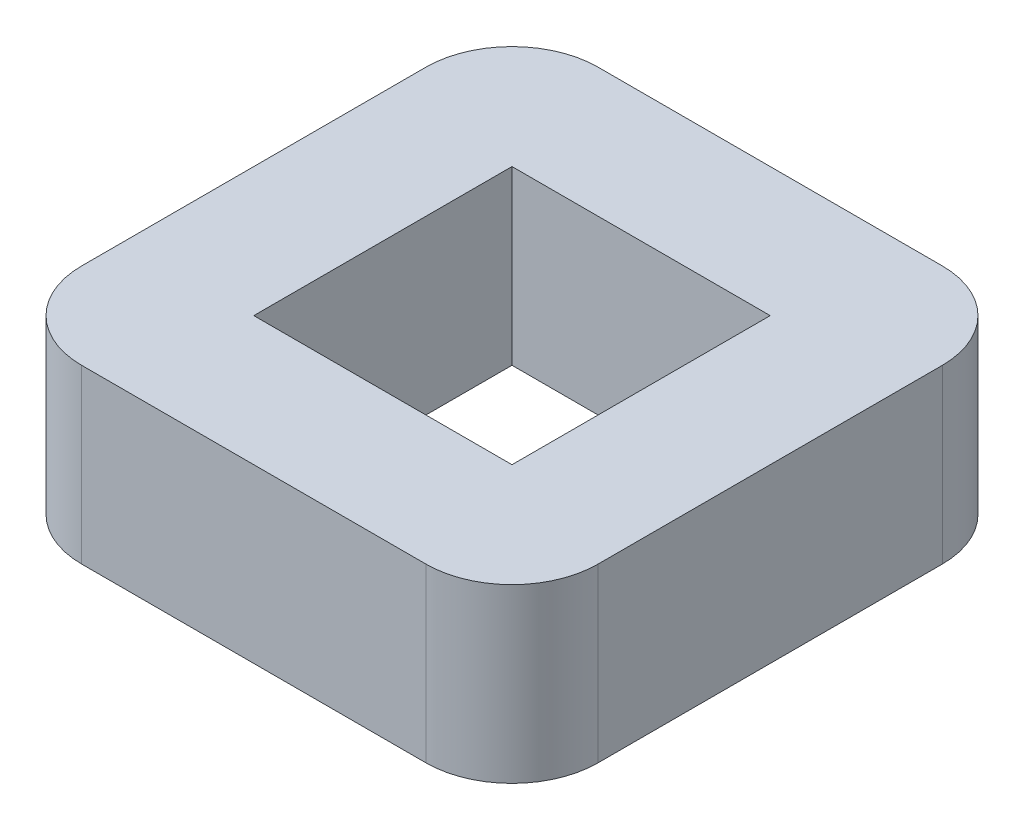
ISO-10303-21;
HEADER;
FILE_DESCRIPTION(('STEP AP214'),'2;1');
FILE_NAME('part.step','',(''),(''),'','','');
FILE_SCHEMA(('AUTOMOTIVE_DESIGN { 1 0 10303 214 1 1 1 1 }'));
ENDSEC;
DATA;
#1=APPLICATION_CONTEXT('core data for automotive mechanical design processes');
#2=APPLICATION_PROTOCOL_DEFINITION('international standard','automotive_design',2000,#1);
#3=PRODUCT_CONTEXT('',#1,'mechanical');
#4=PRODUCT('Part','Part','',(#3));
#5=PRODUCT_RELATED_PRODUCT_CATEGORY('part','',(#4));
#6=PRODUCT_DEFINITION_FORMATION('','',#4);
#7=PRODUCT_DEFINITION_CONTEXT('part definition',#1,'design');
#8=PRODUCT_DEFINITION('design','',#6,#7);
#9=PRODUCT_DEFINITION_SHAPE('','',#8);
#10=(LENGTH_UNIT() NAMED_UNIT(*) SI_UNIT(.MILLI.,.METRE.));
#11=(NAMED_UNIT(*) PLANE_ANGLE_UNIT() SI_UNIT($,.RADIAN.));
#12=(NAMED_UNIT(*) SI_UNIT($,.STERADIAN.) SOLID_ANGLE_UNIT());
#13=UNCERTAINTY_MEASURE_WITH_UNIT(LENGTH_MEASURE(1.E-05),#10,'distance_accuracy_value','');
#14=(GEOMETRIC_REPRESENTATION_CONTEXT(3) GLOBAL_UNCERTAINTY_ASSIGNED_CONTEXT((#13)) GLOBAL_UNIT_ASSIGNED_CONTEXT((#10,
#11,#12)) REPRESENTATION_CONTEXT('',''));
#15=CARTESIAN_POINT('',(0.,0.,0.));
#16=DIRECTION('',(0.,0.,1.));
#17=DIRECTION('',(1.,0.,0.));
#18=AXIS2_PLACEMENT_3D('',#15,#16,#17);
#19=CARTESIAN_POINT('',(-20.,10.,20.));
#20=DIRECTION('',(0.,-1.,0.));
#21=DIRECTION('',(0.,0.,-1.));
#22=AXIS2_PLACEMENT_3D('',#19,#20,#21);
#23=PLANE('',#22);
#24=CARTESIAN_POINT('',(-20.,10.,20.));
#25=DIRECTION('',(0.,1.,0.));
#26=DIRECTION('',(0.,0.,-1.));
#27=AXIS2_PLACEMENT_3D('',#24,#25,#26);
#28=CIRCLE('',#27,10.);
#29=CARTESIAN_POINT('',(-30.,10.,20.));
#30=VERTEX_POINT('',#29);
#31=CARTESIAN_POINT('',(-20.,10.,30.));
#32=VERTEX_POINT('',#31);
#33=EDGE_CURVE('E158',#30,#32,#28,.T.);
#34=ORIENTED_EDGE('',*,*,#33,.T.);
#35=DIRECTION('',(1.,0.,0.));
#36=VECTOR('',#35,1.);
#37=CARTESIAN_POINT('',(-20.,10.,30.));
#38=LINE('',#37,#36);
#39=CARTESIAN_POINT('',(20.,10.,30.));
#40=VERTEX_POINT('',#39);
#41=EDGE_CURVE('E161',#32,#40,#38,.T.);
#42=ORIENTED_EDGE('',*,*,#41,.T.);
#43=CARTESIAN_POINT('',(20.,10.,20.));
#44=DIRECTION('',(0.,1.,0.));
#45=DIRECTION('',(0.,0.,-1.));
#46=AXIS2_PLACEMENT_3D('',#43,#44,#45);
#47=CIRCLE('',#46,10.);
#48=CARTESIAN_POINT('',(30.,10.,20.));
#49=VERTEX_POINT('',#48);
#50=EDGE_CURVE('E164',#40,#49,#47,.T.);
#51=ORIENTED_EDGE('',*,*,#50,.T.);
#52=DIRECTION('',(0.,0.,-1.));
#53=VECTOR('',#52,1.);
#54=CARTESIAN_POINT('',(30.,10.,-20.));
#55=LINE('',#54,#53);
#56=CARTESIAN_POINT('',(30.,10.,-20.));
#57=VERTEX_POINT('',#56);
#58=EDGE_CURVE('E166',#49,#57,#55,.T.);
#59=ORIENTED_EDGE('',*,*,#58,.T.);
#60=CARTESIAN_POINT('',(20.,10.,-20.));
#61=DIRECTION('',(0.,1.,0.));
#62=DIRECTION('',(0.,0.,-1.));
#63=AXIS2_PLACEMENT_3D('',#60,#61,#62);
#64=CIRCLE('',#63,10.);
#65=CARTESIAN_POINT('',(20.,10.,-30.));
#66=VERTEX_POINT('',#65);
#67=EDGE_CURVE('E168',#57,#66,#64,.T.);
#68=ORIENTED_EDGE('',*,*,#67,.T.);
#69=DIRECTION('',(-1.,0.,0.));
#70=VECTOR('',#69,1.);
#71=CARTESIAN_POINT('',(-20.,10.,-30.));
#72=LINE('',#71,#70);
#73=CARTESIAN_POINT('',(-20.,10.,-30.));
#74=VERTEX_POINT('',#73);
#75=EDGE_CURVE('E170',#66,#74,#72,.T.);
#76=ORIENTED_EDGE('',*,*,#75,.T.);
#77=CARTESIAN_POINT('',(-20.,10.,-20.));
#78=DIRECTION('',(0.,1.,0.));
#79=DIRECTION('',(0.,0.,1.));
#80=AXIS2_PLACEMENT_3D('',#77,#78,#79);
#81=CIRCLE('',#80,10.);
#82=CARTESIAN_POINT('',(-30.,10.,-20.));
#83=VERTEX_POINT('',#82);
#84=EDGE_CURVE('E172',#74,#83,#81,.T.);
#85=ORIENTED_EDGE('',*,*,#84,.T.);
#86=DIRECTION('',(0.,0.,1.));
#87=VECTOR('',#86,1.);
#88=CARTESIAN_POINT('',(-30.,10.,-20.));
#89=LINE('',#88,#87);
#90=EDGE_CURVE('E174',#83,#30,#89,.T.);
#91=ORIENTED_EDGE('',*,*,#90,.T.);
#92=EDGE_LOOP('',(#34,#42,#51,#59,#68,#76,#85,#91));
#93=FACE_BOUND('',#92,.T.);
#94=DIRECTION('',(0.,0.,-1.));
#95=VECTOR('',#94,1.);
#96=CARTESIAN_POINT('',(15.,10.,-15.));
#97=LINE('',#96,#95);
#98=CARTESIAN_POINT('',(15.,10.,15.));
#99=VERTEX_POINT('',#98);
#100=CARTESIAN_POINT('',(15.,10.,-15.));
#101=VERTEX_POINT('',#100);
#102=EDGE_CURVE('E122',#99,#101,#97,.T.);
#103=ORIENTED_EDGE('',*,*,#102,.F.);
#104=DIRECTION('',(1.,0.,0.));
#105=VECTOR('',#104,1.);
#106=CARTESIAN_POINT('',(-15.,10.,15.));
#107=LINE('',#106,#105);
#108=CARTESIAN_POINT('',(-15.,10.,15.));
#109=VERTEX_POINT('',#108);
#110=EDGE_CURVE('E144',#109,#99,#107,.T.);
#111=ORIENTED_EDGE('',*,*,#110,.F.);
#112=DIRECTION('',(0.,0.,1.));
#113=VECTOR('',#112,1.);
#114=CARTESIAN_POINT('',(-15.,10.,-15.));
#115=LINE('',#114,#113);
#116=CARTESIAN_POINT('',(-15.,10.,-15.));
#117=VERTEX_POINT('',#116);
#118=EDGE_CURVE('E142',#117,#109,#115,.T.);
#119=ORIENTED_EDGE('',*,*,#118,.F.);
#120=DIRECTION('',(-1.,0.,0.));
#121=VECTOR('',#120,1.);
#122=CARTESIAN_POINT('',(-15.,10.,-15.));
#123=LINE('',#122,#121);
#124=EDGE_CURVE('E130',#101,#117,#123,.T.);
#125=ORIENTED_EDGE('',*,*,#124,.F.);
#126=EDGE_LOOP('',(#103,#111,#119,#125));
#127=FACE_BOUND('',#126,.T.);
#128=ADVANCED_FACE('F33',(#93,#127),#23,.F.);
#129=CARTESIAN_POINT('',(-20.,-10.,20.));
#130=DIRECTION('',(0.,-1.,0.));
#131=DIRECTION('',(0.,0.,-1.));
#132=AXIS2_PLACEMENT_3D('',#129,#130,#131);
#133=PLANE('',#132);
#134=CARTESIAN_POINT('',(-20.,-10.,20.));
#135=DIRECTION('',(0.,1.,0.));
#136=DIRECTION('',(0.,0.,-1.));
#137=AXIS2_PLACEMENT_3D('',#134,#135,#136);
#138=CIRCLE('',#137,10.);
#139=CARTESIAN_POINT('',(-30.,-10.,20.));
#140=VERTEX_POINT('',#139);
#141=CARTESIAN_POINT('',(-20.,-10.,30.));
#142=VERTEX_POINT('',#141);
#143=EDGE_CURVE('E138',#140,#142,#138,.T.);
#144=ORIENTED_EDGE('',*,*,#143,.F.);
#145=DIRECTION('',(0.,0.,1.));
#146=VECTOR('',#145,1.);
#147=CARTESIAN_POINT('',(-30.,-10.,-20.));
#148=LINE('',#147,#146);
#149=CARTESIAN_POINT('',(-30.,-10.,-20.));
#150=VERTEX_POINT('',#149);
#151=EDGE_CURVE('E162',#150,#140,#148,.T.);
#152=ORIENTED_EDGE('',*,*,#151,.F.);
#153=CARTESIAN_POINT('',(-20.,-10.,-20.));
#154=DIRECTION('',(0.,1.,0.));
#155=DIRECTION('',(0.,0.,1.));
#156=AXIS2_PLACEMENT_3D('',#153,#154,#155);
#157=CIRCLE('',#156,10.);
#158=CARTESIAN_POINT('',(-20.,-10.,-30.));
#159=VERTEX_POINT('',#158);
#160=EDGE_CURVE('E189',#159,#150,#157,.T.);
#161=ORIENTED_EDGE('',*,*,#160,.F.);
#162=DIRECTION('',(-1.,0.,0.));
#163=VECTOR('',#162,1.);
#164=CARTESIAN_POINT('',(-20.,-10.,-30.));
#165=LINE('',#164,#163);
#166=CARTESIAN_POINT('',(20.,-10.,-30.));
#167=VERTEX_POINT('',#166);
#168=EDGE_CURVE('E187',#167,#159,#165,.T.);
#169=ORIENTED_EDGE('',*,*,#168,.F.);
#170=CARTESIAN_POINT('',(20.,-10.,-20.));
#171=DIRECTION('',(0.,1.,0.));
#172=DIRECTION('',(0.,0.,-1.));
#173=AXIS2_PLACEMENT_3D('',#170,#171,#172);
#174=CIRCLE('',#173,10.);
#175=CARTESIAN_POINT('',(30.,-10.,-20.));
#176=VERTEX_POINT('',#175);
#177=EDGE_CURVE('E185',#176,#167,#174,.T.);
#178=ORIENTED_EDGE('',*,*,#177,.F.);
#179=DIRECTION('',(0.,0.,-1.));
#180=VECTOR('',#179,1.);
#181=CARTESIAN_POINT('',(30.,-10.,-20.));
#182=LINE('',#181,#180);
#183=CARTESIAN_POINT('',(30.,-10.,20.));
#184=VERTEX_POINT('',#183);
#185=EDGE_CURVE('E183',#184,#176,#182,.T.);
#186=ORIENTED_EDGE('',*,*,#185,.F.);
#187=CARTESIAN_POINT('',(20.,-10.,20.));
#188=DIRECTION('',(0.,1.,0.));
#189=DIRECTION('',(0.,0.,-1.));
#190=AXIS2_PLACEMENT_3D('',#187,#188,#189);
#191=CIRCLE('',#190,10.);
#192=CARTESIAN_POINT('',(20.,-10.,30.));
#193=VERTEX_POINT('',#192);
#194=EDGE_CURVE('E181',#193,#184,#191,.T.);
#195=ORIENTED_EDGE('',*,*,#194,.F.);
#196=DIRECTION('',(1.,0.,0.));
#197=VECTOR('',#196,1.);
#198=CARTESIAN_POINT('',(-20.,-10.,30.));
#199=LINE('',#198,#197);
#200=EDGE_CURVE('E179',#142,#193,#199,.T.);
#201=ORIENTED_EDGE('',*,*,#200,.F.);
#202=EDGE_LOOP('',(#144,#152,#161,#169,#178,#186,#195,#201));
#203=FACE_BOUND('',#202,.T.);
#204=DIRECTION('',(1.,0.,0.));
#205=VECTOR('',#204,1.);
#206=CARTESIAN_POINT('',(-15.,-10.,15.));
#207=LINE('',#206,#205);
#208=CARTESIAN_POINT('',(-15.,-10.,15.));
#209=VERTEX_POINT('',#208);
#210=CARTESIAN_POINT('',(15.,-10.,15.));
#211=VERTEX_POINT('',#210);
#212=EDGE_CURVE('E131',#209,#211,#207,.T.);
#213=ORIENTED_EDGE('',*,*,#212,.T.);
#214=DIRECTION('',(0.,0.,-1.));
#215=VECTOR('',#214,1.);
#216=CARTESIAN_POINT('',(15.,-10.,-15.));
#217=LINE('',#216,#215);
#218=CARTESIAN_POINT('',(15.,-10.,-15.));
#219=VERTEX_POINT('',#218);
#220=EDGE_CURVE('E56',#211,#219,#217,.T.);
#221=ORIENTED_EDGE('',*,*,#220,.T.);
#222=DIRECTION('',(-1.,0.,0.));
#223=VECTOR('',#222,1.);
#224=CARTESIAN_POINT('',(-15.,-10.,-15.));
#225=LINE('',#224,#223);
#226=CARTESIAN_POINT('',(-15.,-10.,-15.));
#227=VERTEX_POINT('',#226);
#228=EDGE_CURVE('E137',#219,#227,#225,.T.);
#229=ORIENTED_EDGE('',*,*,#228,.T.);
#230=DIRECTION('',(0.,0.,1.));
#231=VECTOR('',#230,1.);
#232=CARTESIAN_POINT('',(-15.,-10.,-15.));
#233=LINE('',#232,#231);
#234=EDGE_CURVE('E150',#227,#209,#233,.T.);
#235=ORIENTED_EDGE('',*,*,#234,.T.);
#236=EDGE_LOOP('',(#213,#221,#229,#235));
#237=FACE_BOUND('',#236,.T.);
#238=ADVANCED_FACE('F219',(#203,#237),#133,.T.);
#239=CARTESIAN_POINT('',(-20.,10.,20.));
#240=DIRECTION('',(0.,-1.,0.));
#241=DIRECTION('',(0.,0.,-1.));
#242=AXIS2_PLACEMENT_3D('',#239,#240,#241);
#243=CYLINDRICAL_SURFACE('',#242,10.);
#244=ORIENTED_EDGE('',*,*,#143,.T.);
#245=DIRECTION('',(0.,-1.,0.));
#246=VECTOR('',#245,1.);
#247=CARTESIAN_POINT('',(-20.,10.,30.));
#248=LINE('',#247,#246);
#249=EDGE_CURVE('E11',#32,#142,#248,.T.);
#250=ORIENTED_EDGE('',*,*,#249,.F.);
#251=ORIENTED_EDGE('',*,*,#33,.F.);
#252=DIRECTION('',(0.,-1.,0.));
#253=VECTOR('',#252,1.);
#254=CARTESIAN_POINT('',(-30.,10.,20.));
#255=LINE('',#254,#253);
#256=EDGE_CURVE('E176',#30,#140,#255,.T.);
#257=ORIENTED_EDGE('',*,*,#256,.T.);
#258=EDGE_LOOP('',(#244,#250,#251,#257));
#259=FACE_BOUND('',#258,.T.);
#260=ADVANCED_FACE('F35',(#259),#243,.T.);
#261=CARTESIAN_POINT('',(-20.,10.,30.));
#262=DIRECTION('',(0.,0.,-1.));
#263=DIRECTION('',(-1.,0.,0.));
#264=AXIS2_PLACEMENT_3D('',#261,#262,#263);
#265=PLANE('',#264);
#266=ORIENTED_EDGE('',*,*,#200,.T.);
#267=DIRECTION('',(0.,-1.,0.));
#268=VECTOR('',#267,1.);
#269=CARTESIAN_POINT('',(20.,10.,30.));
#270=LINE('',#269,#268);
#271=EDGE_CURVE('E41',#40,#193,#270,.T.);
#272=ORIENTED_EDGE('',*,*,#271,.F.);
#273=ORIENTED_EDGE('',*,*,#41,.F.);
#274=ORIENTED_EDGE('',*,*,#249,.T.);
#275=EDGE_LOOP('',(#266,#272,#273,#274));
#276=FACE_BOUND('',#275,.T.);
#277=ADVANCED_FACE('F236',(#276),#265,.F.);
#278=CARTESIAN_POINT('',(20.,10.,20.));
#279=DIRECTION('',(0.,-1.,0.));
#280=DIRECTION('',(0.,0.,-1.));
#281=AXIS2_PLACEMENT_3D('',#278,#279,#280);
#282=CYLINDRICAL_SURFACE('',#281,10.);
#283=ORIENTED_EDGE('',*,*,#194,.T.);
#284=DIRECTION('',(0.,-1.,0.));
#285=VECTOR('',#284,1.);
#286=CARTESIAN_POINT('',(30.,10.,20.));
#287=LINE('',#286,#285);
#288=EDGE_CURVE('E206',#49,#184,#287,.T.);
#289=ORIENTED_EDGE('',*,*,#288,.F.);
#290=ORIENTED_EDGE('',*,*,#50,.F.);
#291=ORIENTED_EDGE('',*,*,#271,.T.);
#292=EDGE_LOOP('',(#283,#289,#290,#291));
#293=FACE_BOUND('',#292,.T.);
#294=ADVANCED_FACE('F213',(#293),#282,.T.);
#295=CARTESIAN_POINT('',(30.,10.,-20.));
#296=DIRECTION('',(-1.,0.,0.));
#297=DIRECTION('',(0.,0.,1.));
#298=AXIS2_PLACEMENT_3D('',#295,#296,#297);
#299=PLANE('',#298);
#300=ORIENTED_EDGE('',*,*,#185,.T.);
#301=DIRECTION('',(0.,-1.,0.));
#302=VECTOR('',#301,1.);
#303=CARTESIAN_POINT('',(30.,10.,-20.));
#304=LINE('',#303,#302);
#305=EDGE_CURVE('E203',#57,#176,#304,.T.);
#306=ORIENTED_EDGE('',*,*,#305,.F.);
#307=ORIENTED_EDGE('',*,*,#58,.F.);
#308=ORIENTED_EDGE('',*,*,#288,.T.);
#309=EDGE_LOOP('',(#300,#306,#307,#308));
#310=FACE_BOUND('',#309,.T.);
#311=ADVANCED_FACE('F225',(#310),#299,.F.);
#312=CARTESIAN_POINT('',(20.,10.,-20.));
#313=DIRECTION('',(0.,-1.,0.));
#314=DIRECTION('',(0.,0.,-1.));
#315=AXIS2_PLACEMENT_3D('',#312,#313,#314);
#316=CYLINDRICAL_SURFACE('',#315,10.);
#317=ORIENTED_EDGE('',*,*,#177,.T.);
#318=DIRECTION('',(0.,-1.,0.));
#319=VECTOR('',#318,1.);
#320=CARTESIAN_POINT('',(20.,10.,-30.));
#321=LINE('',#320,#319);
#322=EDGE_CURVE('E200',#66,#167,#321,.T.);
#323=ORIENTED_EDGE('',*,*,#322,.F.);
#324=ORIENTED_EDGE('',*,*,#67,.F.);
#325=ORIENTED_EDGE('',*,*,#305,.T.);
#326=EDGE_LOOP('',(#317,#323,#324,#325));
#327=FACE_BOUND('',#326,.T.);
#328=ADVANCED_FACE('F229',(#327),#316,.T.);
#329=CARTESIAN_POINT('',(-20.,10.,-30.));
#330=DIRECTION('',(0.,0.,1.));
#331=DIRECTION('',(1.,0.,0.));
#332=AXIS2_PLACEMENT_3D('',#329,#330,#331);
#333=PLANE('',#332);
#334=ORIENTED_EDGE('',*,*,#168,.T.);
#335=DIRECTION('',(0.,-1.,0.));
#336=VECTOR('',#335,1.);
#337=CARTESIAN_POINT('',(-20.,10.,-30.));
#338=LINE('',#337,#336);
#339=EDGE_CURVE('E197',#74,#159,#338,.T.);
#340=ORIENTED_EDGE('',*,*,#339,.F.);
#341=ORIENTED_EDGE('',*,*,#75,.F.);
#342=ORIENTED_EDGE('',*,*,#322,.T.);
#343=EDGE_LOOP('',(#334,#340,#341,#342));
#344=FACE_BOUND('',#343,.T.);
#345=ADVANCED_FACE('F249',(#344),#333,.F.);
#346=CARTESIAN_POINT('',(-20.,10.,-20.));
#347=DIRECTION('',(0.,-1.,0.));
#348=DIRECTION('',(0.,0.,-1.));
#349=AXIS2_PLACEMENT_3D('',#346,#347,#348);
#350=CYLINDRICAL_SURFACE('',#349,10.);
#351=ORIENTED_EDGE('',*,*,#160,.T.);
#352=DIRECTION('',(0.,-1.,0.));
#353=VECTOR('',#352,1.);
#354=CARTESIAN_POINT('',(-30.,10.,-20.));
#355=LINE('',#354,#353);
#356=EDGE_CURVE('E194',#83,#150,#355,.T.);
#357=ORIENTED_EDGE('',*,*,#356,.F.);
#358=ORIENTED_EDGE('',*,*,#84,.F.);
#359=ORIENTED_EDGE('',*,*,#339,.T.);
#360=EDGE_LOOP('',(#351,#357,#358,#359));
#361=FACE_BOUND('',#360,.T.);
#362=ADVANCED_FACE('F247',(#361),#350,.T.);
#363=CARTESIAN_POINT('',(-30.,10.,-20.));
#364=DIRECTION('',(1.,0.,0.));
#365=DIRECTION('',(0.,0.,-1.));
#366=AXIS2_PLACEMENT_3D('',#363,#364,#365);
#367=PLANE('',#366);
#368=ORIENTED_EDGE('',*,*,#151,.T.);
#369=ORIENTED_EDGE('',*,*,#256,.F.);
#370=ORIENTED_EDGE('',*,*,#90,.F.);
#371=ORIENTED_EDGE('',*,*,#356,.T.);
#372=EDGE_LOOP('',(#368,#369,#370,#371));
#373=FACE_BOUND('',#372,.T.);
#374=ADVANCED_FACE('F242',(#373),#367,.F.);
#375=CARTESIAN_POINT('',(15.,10.,-15.));
#376=DIRECTION('',(-1.,0.,0.));
#377=DIRECTION('',(0.,0.,1.));
#378=AXIS2_PLACEMENT_3D('',#375,#376,#377);
#379=PLANE('',#378);
#380=ORIENTED_EDGE('',*,*,#220,.F.);
#381=DIRECTION('',(0.,-1.,0.));
#382=VECTOR('',#381,1.);
#383=CARTESIAN_POINT('',(15.,10.,15.));
#384=LINE('',#383,#382);
#385=EDGE_CURVE('E126',#99,#211,#384,.T.);
#386=ORIENTED_EDGE('',*,*,#385,.F.);
#387=ORIENTED_EDGE('',*,*,#102,.T.);
#388=DIRECTION('',(0.,-1.,0.));
#389=VECTOR('',#388,1.);
#390=CARTESIAN_POINT('',(15.,10.,-15.));
#391=LINE('',#390,#389);
#392=EDGE_CURVE('E125',#101,#219,#391,.T.);
#393=ORIENTED_EDGE('',*,*,#392,.T.);
#394=EDGE_LOOP('',(#380,#386,#387,#393));
#395=FACE_BOUND('',#394,.T.);
#396=ADVANCED_FACE('F124',(#395),#379,.T.);
#397=CARTESIAN_POINT('',(-15.,10.,-15.));
#398=DIRECTION('',(0.,0.,1.));
#399=DIRECTION('',(1.,0.,0.));
#400=AXIS2_PLACEMENT_3D('',#397,#398,#399);
#401=PLANE('',#400);
#402=ORIENTED_EDGE('',*,*,#228,.F.);
#403=ORIENTED_EDGE('',*,*,#392,.F.);
#404=ORIENTED_EDGE('',*,*,#124,.T.);
#405=DIRECTION('',(0.,-1.,0.));
#406=VECTOR('',#405,1.);
#407=CARTESIAN_POINT('',(-15.,10.,-15.));
#408=LINE('',#407,#406);
#409=EDGE_CURVE('E139',#117,#227,#408,.T.);
#410=ORIENTED_EDGE('',*,*,#409,.T.);
#411=EDGE_LOOP('',(#402,#403,#404,#410));
#412=FACE_BOUND('',#411,.T.);
#413=ADVANCED_FACE('F134',(#412),#401,.T.);
#414=CARTESIAN_POINT('',(-15.,10.,-15.));
#415=DIRECTION('',(1.,0.,0.));
#416=DIRECTION('',(0.,0.,-1.));
#417=AXIS2_PLACEMENT_3D('',#414,#415,#416);
#418=PLANE('',#417);
#419=ORIENTED_EDGE('',*,*,#234,.F.);
#420=ORIENTED_EDGE('',*,*,#409,.F.);
#421=ORIENTED_EDGE('',*,*,#118,.T.);
#422=DIRECTION('',(0.,-1.,0.));
#423=VECTOR('',#422,1.);
#424=CARTESIAN_POINT('',(-15.,10.,15.));
#425=LINE('',#424,#423);
#426=EDGE_CURVE('E48',#109,#209,#425,.T.);
#427=ORIENTED_EDGE('',*,*,#426,.T.);
#428=EDGE_LOOP('',(#419,#420,#421,#427));
#429=FACE_BOUND('',#428,.T.);
#430=ADVANCED_FACE('F274',(#429),#418,.T.);
#431=CARTESIAN_POINT('',(-15.,10.,15.));
#432=DIRECTION('',(0.,0.,-1.));
#433=DIRECTION('',(-1.,0.,0.));
#434=AXIS2_PLACEMENT_3D('',#431,#432,#433);
#435=PLANE('',#434);
#436=ORIENTED_EDGE('',*,*,#212,.F.);
#437=ORIENTED_EDGE('',*,*,#426,.F.);
#438=ORIENTED_EDGE('',*,*,#110,.T.);
#439=ORIENTED_EDGE('',*,*,#385,.T.);
#440=EDGE_LOOP('',(#436,#437,#438,#439));
#441=FACE_BOUND('',#440,.T.);
#442=ADVANCED_FACE('F278',(#441),#435,.T.);
#443=CLOSED_SHELL('',(#128,#238,#260,#277,#294,#311,#328,#345,#362,#374,#396,#413,#430,#442));
#444=MANIFOLD_SOLID_BREP('B2',#443);
#445=ADVANCED_BREP_SHAPE_REPRESENTATION('',(#18,#444),#14);
#446=SHAPE_DEFINITION_REPRESENTATION(#9,#445);
ENDSEC;
END-ISO-10303-21;
